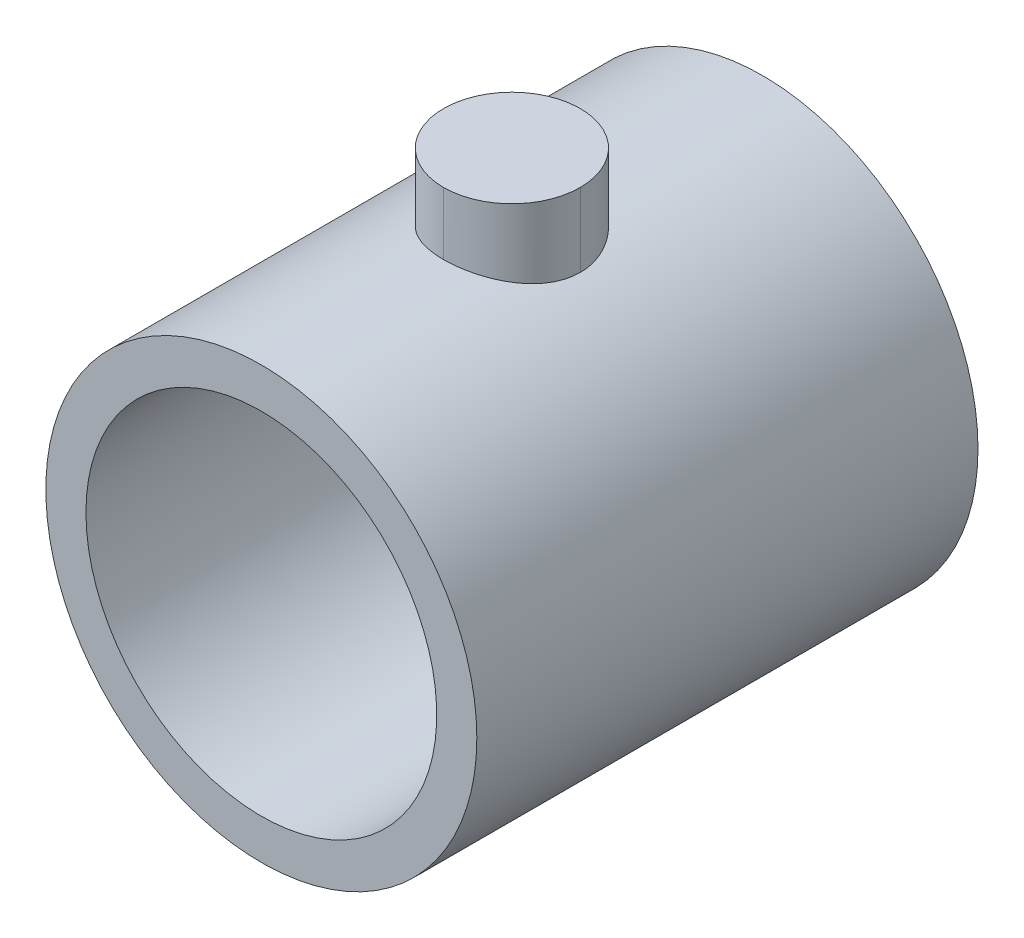
ISO-10303-21;
HEADER;
FILE_DESCRIPTION(('STEP AP214'),'2;1');
FILE_NAME('part.step','',(''),(''),'','','');
FILE_SCHEMA(('AUTOMOTIVE_DESIGN { 1 0 10303 214 1 1 1 1 }'));
ENDSEC;
DATA;
#1=APPLICATION_CONTEXT('core data for automotive mechanical design processes');
#2=APPLICATION_PROTOCOL_DEFINITION('international standard','automotive_design',2000,#1);
#3=PRODUCT_CONTEXT('',#1,'mechanical');
#4=PRODUCT('Part','Part','',(#3));
#5=PRODUCT_RELATED_PRODUCT_CATEGORY('part','',(#4));
#6=PRODUCT_DEFINITION_FORMATION('','',#4);
#7=PRODUCT_DEFINITION_CONTEXT('part definition',#1,'design');
#8=PRODUCT_DEFINITION('design','',#6,#7);
#9=PRODUCT_DEFINITION_SHAPE('','',#8);
#10=(LENGTH_UNIT() NAMED_UNIT(*) SI_UNIT(.MILLI.,.METRE.));
#11=(NAMED_UNIT(*) PLANE_ANGLE_UNIT() SI_UNIT($,.RADIAN.));
#12=(NAMED_UNIT(*) SI_UNIT($,.STERADIAN.) SOLID_ANGLE_UNIT());
#13=UNCERTAINTY_MEASURE_WITH_UNIT(LENGTH_MEASURE(1.E-05),#10,'distance_accuracy_value','');
#14=(GEOMETRIC_REPRESENTATION_CONTEXT(3) GLOBAL_UNCERTAINTY_ASSIGNED_CONTEXT((#13)) GLOBAL_UNIT_ASSIGNED_CONTEXT((#10,
#11,#12)) REPRESENTATION_CONTEXT('',''));
#15=CARTESIAN_POINT('',(0.,0.,0.));
#16=DIRECTION('',(0.,0.,1.));
#17=DIRECTION('',(1.,0.,0.));
#18=AXIS2_PLACEMENT_3D('',#15,#16,#17);
#19=CARTESIAN_POINT('',(-299.1,352.3,674.8));
#20=DIRECTION('',(0.,0.,-1.));
#21=DIRECTION('',(-1.,0.,0.));
#22=AXIS2_PLACEMENT_3D('',#19,#20,#21);
#23=CYLINDRICAL_SURFACE('',#22,21.5);
#24=CARTESIAN_POINT('',(-299.1,373.8,656.619762670699));
#25=CARTESIAN_POINT('',(-299.286849611136,373.800023702108,656.619788055512));
#26=CARTESIAN_POINT('',(-299.473689988001,373.797565078871,656.612084790181));
#27=CARTESIAN_POINT('',(-299.845948822613,373.787855810695,656.581408525158));
#28=CARTESIAN_POINT('',(-300.031367576311,373.780606192138,656.558438796016));
#29=CARTESIAN_POINT('',(-300.398992559049,373.761511751632,656.49749466458));
#30=CARTESIAN_POINT('',(-300.581205762463,373.74967867033,656.459558594359));
#31=CARTESIAN_POINT('',(-300.941619114471,373.721743452542,656.369027360901));
#32=CARTESIAN_POINT('',(-301.119819170887,373.705641218104,656.316431861316));
#33=CARTESIAN_POINT('',(-301.470892076553,373.669604599317,656.197061325536));
#34=CARTESIAN_POINT('',(-301.643767763472,373.649672298727,656.130293997506));
#35=CARTESIAN_POINT('',(-301.983230897939,373.606484179976,655.983072339063));
#36=CARTESIAN_POINT('',(-302.149815980216,373.58322712713,655.902612921812));
#37=CARTESIAN_POINT('',(-302.475598459927,373.53399349314,655.728625618388));
#38=CARTESIAN_POINT('',(-302.634795590768,373.508016813969,655.635097261111));
#39=CARTESIAN_POINT('',(-302.944900468567,373.453995485725,655.435593111171));
#40=CARTESIAN_POINT('',(-303.095805045667,373.425950055329,655.329612606545));
#41=CARTESIAN_POINT('',(-303.392490753908,373.36770077459,655.102784678811));
#42=CARTESIAN_POINT('',(-303.538009218773,373.337458437253,654.981603478992));
#43=CARTESIAN_POINT('',(-303.818448591531,373.276340252885,654.727596880684));
#44=CARTESIAN_POINT('',(-303.953365798489,373.245464189319,654.5947674497));
#45=CARTESIAN_POINT('',(-304.211726811895,373.183914593033,654.31831908519));
#46=CARTESIAN_POINT('',(-304.335169751923,373.153241075768,654.174699338365));
#47=CARTESIAN_POINT('',(-304.569782265903,373.092935246909,653.87755798348));
#48=CARTESIAN_POINT('',(-304.680951900035,373.063302930209,653.724036423975));
#49=CARTESIAN_POINT('',(-304.892980201053,373.005163121555,653.403934350579));
#50=CARTESIAN_POINT('',(-304.993497866132,372.976704536629,653.237118792763));
#51=CARTESIAN_POINT('',(-305.180030643016,372.922624937867,652.895205953089));
#52=CARTESIAN_POINT('',(-305.26605115501,372.897002868656,652.720111786273));
#53=CARTESIAN_POINT('',(-305.422939426782,372.849383537074,652.362749308705));
#54=CARTESIAN_POINT('',(-305.493804995341,372.827386798987,652.180479965015));
#55=CARTESIAN_POINT('',(-305.619706613475,372.787747211921,651.81017710179));
#56=CARTESIAN_POINT('',(-305.674749713154,372.770102424319,651.622146190926));
#57=CARTESIAN_POINT('',(-305.767088268617,372.740210811299,651.247473675112));
#58=CARTESIAN_POINT('',(-305.804873924254,372.727815731898,651.060964682541));
#59=CARTESIAN_POINT('',(-305.864736507772,372.708070383324,650.685252071749));
#60=CARTESIAN_POINT('',(-305.886819875911,372.700718045924,650.496049590773));
#61=CARTESIAN_POINT('',(-305.915081895567,372.691294262848,650.116333606294));
#62=CARTESIAN_POINT('',(-305.92126095149,372.689222682895,649.92582013625));
#63=CARTESIAN_POINT('',(-305.917652304682,372.690429659845,649.544964038913));
#64=CARTESIAN_POINT('',(-305.907864998274,372.693708083949,649.354621407497));
#65=CARTESIAN_POINT('',(-305.873154383857,372.705261433241,648.983386132854));
#66=CARTESIAN_POINT('',(-305.848869975533,372.713325372714,648.802426731596));
#67=CARTESIAN_POINT('',(-305.785925047179,372.734028063015,648.443229572215));
#68=CARTESIAN_POINT('',(-305.747259667153,372.746668360367,648.264992755404));
#69=CARTESIAN_POINT('',(-305.655904627826,372.776142547514,647.912565990144));
#70=CARTESIAN_POINT('',(-305.603219073198,372.792975209822,647.738374873443));
#71=CARTESIAN_POINT('',(-305.484230237097,372.830355350686,647.395049053186));
#72=CARTESIAN_POINT('',(-305.417921798754,372.850904235647,647.225916292301));
#73=CARTESIAN_POINT('',(-305.271146527037,372.895458586382,646.89139906547));
#74=CARTESIAN_POINT('',(-305.190487522478,372.919510042889,646.726105087879));
#75=CARTESIAN_POINT('',(-305.016251126841,372.970176647718,646.402814743336));
#76=CARTESIAN_POINT('',(-304.922669314119,372.99679267258,646.244820898983));
#77=CARTESIAN_POINT('',(-304.723239073506,373.051864497473,645.937104369589));
#78=CARTESIAN_POINT('',(-304.617390008365,373.080320393046,645.787382114831));
#79=CARTESIAN_POINT('',(-304.394099926442,373.13832549305,645.497069982092));
#80=CARTESIAN_POINT('',(-304.276658540224,373.167874732306,645.356480395398));
#81=CARTESIAN_POINT('',(-304.025083998839,373.228714037682,645.078830649772));
#82=CARTESIAN_POINT('',(-303.890424591392,373.260020432104,644.942250415067));
#83=CARTESIAN_POINT('',(-303.610069305523,373.322128313279,644.680903148553));
#84=CARTESIAN_POINT('',(-303.464376961595,373.352929957919,644.556132362065));
#85=CARTESIAN_POINT('',(-303.162757588676,373.413210525628,644.319127323276));
#86=CARTESIAN_POINT('',(-303.006825900327,373.442688836106,644.206898841926));
#87=CARTESIAN_POINT('',(-302.685835723574,373.499488975127,643.995878981829));
#88=CARTESIAN_POINT('',(-302.520780867618,373.526811651582,643.897082308561));
#89=CARTESIAN_POINT('',(-302.181084881348,373.578784966868,643.712821942092));
#90=CARTESIAN_POINT('',(-302.006372897741,373.603410316362,643.627481602057));
#91=CARTESIAN_POINT('',(-301.649960425663,373.649003761545,643.471915284115));
#92=CARTESIAN_POINT('',(-301.468262653344,373.669973261463,643.401683500499));
#93=CARTESIAN_POINT('',(-301.099132755483,373.707659414824,643.2769191724));
#94=CARTESIAN_POINT('',(-300.911700961129,373.724376313372,643.222385723096));
#95=CARTESIAN_POINT('',(-300.532509365557,373.753066466684,643.129529475876));
#96=CARTESIAN_POINT('',(-300.340749743245,373.765039917158,643.091206009149));
#97=CARTESIAN_POINT('',(-299.962076489457,373.783512798463,643.032339213343));
#98=CARTESIAN_POINT('',(-299.775272650719,373.790210654041,643.011150487655));
#99=CARTESIAN_POINT('',(-299.40044415165,373.798717882523,642.984268362587));
#100=CARTESIAN_POINT('',(-299.212419525289,373.80052739087,642.978574533889));
#101=CARTESIAN_POINT('',(-298.836586082805,373.799207500102,642.982735931094));
#102=CARTESIAN_POINT('',(-298.648777241207,373.796078760785,642.992589079777));
#103=CARTESIAN_POINT('',(-298.274758053493,373.784970992056,643.027746366384));
#104=CARTESIAN_POINT('',(-298.088547693752,373.776992004029,643.053050372472));
#105=CARTESIAN_POINT('',(-297.723903444293,373.756673495026,643.118014987086));
#106=CARTESIAN_POINT('',(-297.545393212982,373.744452662484,643.15728547842));
#107=CARTESIAN_POINT('',(-297.192344410749,373.715933934496,643.249936543445));
#108=CARTESIAN_POINT('',(-297.017807187791,373.699634677166,643.303321830744));
#109=CARTESIAN_POINT('',(-296.673954621976,373.663384257814,643.42374377334));
#110=CARTESIAN_POINT('',(-296.504637928147,373.643434050013,643.490776862129));
#111=CARTESIAN_POINT('',(-296.172176384475,373.600374643284,643.638013436823));
#112=CARTESIAN_POINT('',(-296.009033893473,373.577264252263,643.718221895083));
#113=CARTESIAN_POINT('',(-295.686053952057,373.527866421205,643.893334120884));
#114=CARTESIAN_POINT('',(-295.526395382634,373.501515018877,643.988549760478));
#115=CARTESIAN_POINT('',(-295.215567236861,373.446775128878,644.191540871442));
#116=CARTESIAN_POINT('',(-295.064400618421,373.418385939153,644.299320679448));
#117=CARTESIAN_POINT('',(-294.771505232251,373.360304522878,644.526702311104));
#118=CARTESIAN_POINT('',(-294.629776489976,373.330612292815,644.646304166638));
#119=CARTESIAN_POINT('',(-294.356584051908,373.270683495983,644.896583948005));
#120=CARTESIAN_POINT('',(-294.225120588083,373.240446916933,645.027262123996));
#121=CARTESIAN_POINT('',(-293.968075350933,373.178973222865,645.30448122238));
#122=CARTESIAN_POINT('',(-293.842955043228,373.147745853789,645.451452638939));
#123=CARTESIAN_POINT('',(-293.605554945394,373.086440370226,645.755567313567));
#124=CARTESIAN_POINT('',(-293.493270867532,373.056361874225,645.912707147414));
#125=CARTESIAN_POINT('',(-293.282194330325,372.99819161078,646.236342838258));
#126=CARTESIAN_POINT('',(-293.183413013589,372.97010149327,646.402846264183));
#127=CARTESIAN_POINT('',(-293.000235981383,372.916788781065,646.743940577196));
#128=CARTESIAN_POINT('',(-292.915834306316,372.891564999876,646.918528075526));
#129=CARTESIAN_POINT('',(-292.762233822952,372.84480846978,647.27426617975));
#130=CARTESIAN_POINT('',(-292.693000523062,372.823267371815,647.455400781107));
#131=CARTESIAN_POINT('',(-292.570128622886,372.784504727019,647.823254051486));
#132=CARTESIAN_POINT('',(-292.51648323668,372.767281301017,648.009970251497));
#133=CARTESIAN_POINT('',(-292.425338249881,372.737739203865,648.387319311367));
#134=CARTESIAN_POINT('',(-292.387809650324,372.725411726458,648.577944484521));
#135=CARTESIAN_POINT('',(-292.329152353413,372.706042893602,648.961876403566));
#136=CARTESIAN_POINT('',(-292.308012762598,372.698998027005,649.15518128117));
#137=CARTESIAN_POINT('',(-292.290187152217,372.693049448027,649.424121702964));
#138=CARTESIAN_POINT('',(-292.286454160968,372.691802269177,649.49929442607));
#139=CARTESIAN_POINT('',(-292.281480962213,372.690139901925,649.649641553976));
#140=CARTESIAN_POINT('',(-292.280237781932,372.689723721332,649.724815849473));
#141=CARTESIAN_POINT('',(-292.280237329301,372.689723811649,649.8));
#142=B_SPLINE_CURVE_WITH_KNOTS('',3,(#24,#25,#26,#27,#28,#29,#30,#31,#32,#33,#34,#35,#36,#37,
#38,#39,#40,#41,#42,#43,#44,#45,#46,#47,#48,#49,#50,#51,#52,#53,#54,#55,#56,#57,#58,#59,#60,#61,
#62,#63,#64,#65,#66,#67,#68,#69,#70,#71,#72,#73,#74,#75,#76,#77,#78,#79,#80,#81,#82,#83,#84,#85,
#86,#87,#88,#89,#90,#91,#92,#93,#94,#95,#96,#97,#98,#99,#100,#101,#102,#103,#104,#105,#106,#107,
#108,#109,#110,#111,#112,#113,#114,#115,#116,#117,#118,#119,#120,#121,#122,#123,#124,#125,#126,
#127,#128,#129,#130,#131,#132,#133,#134,#135,#136,#137,#138,#139,#140,#141),.UNSPECIFIED.,.F.,
.F.,(4,2,2,2,2,2,2,2,2,2,2,2,2,2,2,2,2,2,2,2,2,2,2,2,2,2,2,2,2,2,2,2,2,2,2,2,2,2,2,2,2,2,2,2,2,
2,2,2,2,2,2,2,2,2,2,2,2,2,4),(0.,0.560359743781014,1.12059947978438,1.67941353888878,
2.23824042055313,2.79676412738771,3.35549578982915,3.9142475983866,4.47321152690176,
5.04786350368018,5.62271521021412,6.19761028853445,6.7725025478804,7.36226211736002,
7.95180151357612,8.54142609241195,9.13078754032882,9.70216934553045,10.2733166643894,
10.8444494602515,11.4155680794587,11.9632037918613,12.5110247441492,13.0586854875736,
13.6065539283805,14.1624030042838,14.718442741849,15.2745113770874,15.8305977395095,
16.4129354865586,16.9950874596482,17.5775061985007,18.1596946910844,18.7469435168708,
19.3339662780239,19.9209551975628,20.5079198960321,21.0715850282617,21.6352345428268,
22.1988087549951,22.7623781585073,23.3113041065293,23.8604135993869,24.4093797801366,
24.9585536175636,25.5211813010285,26.0840037586825,26.6468277342929,27.2096644246007,
27.7955546516793,28.38124859628,28.9674229804796,29.5533538324634,30.137938171304,
30.7222676391732,31.3055412714969,31.8884268797905,32.1142179830095,32.3397393359071),.UNSPECIFIED.);
#143=CARTESIAN_POINT('',(-299.1,373.8,656.619762670699));
#144=VERTEX_POINT('',#143);
#145=CARTESIAN_POINT('',(-292.280237329301,372.689723811649,649.8));
#146=VERTEX_POINT('',#145);
#147=EDGE_CURVE('E63',#144,#146,#142,.T.);
#148=ORIENTED_EDGE('',*,*,#147,.T.);
#149=CARTESIAN_POINT('',(-292.280237329301,372.689723811649,649.8));
#150=CARTESIAN_POINT('',(-292.280211416672,372.689695078506,649.986616922159));
#151=CARTESIAN_POINT('',(-292.287896057839,372.692284862618,650.173223202868));
#152=CARTESIAN_POINT('',(-292.318494089589,372.702491409205,650.544999835778));
#153=CARTESIAN_POINT('',(-292.341403711886,372.710106927773,650.730170531825));
#154=CARTESIAN_POINT('',(-292.40217394527,372.730126887538,651.097238139797));
#155=CARTESIAN_POINT('',(-292.439992326143,372.74251779986,651.279142794413));
#156=CARTESIAN_POINT('',(-292.530230044217,372.771697136978,651.638934270502));
#157=CARTESIAN_POINT('',(-292.582649834885,372.788485698347,651.816820967005));
#158=CARTESIAN_POINT('',(-292.701600904426,372.825943726534,652.167249354588));
#159=CARTESIAN_POINT('',(-292.76812258176,372.84661055167,652.339794591356));
#160=CARTESIAN_POINT('',(-292.914792703252,372.891238082411,652.678622316006));
#161=CARTESIAN_POINT('',(-292.994946207961,372.915200010625,652.844902449985));
#162=CARTESIAN_POINT('',(-293.168283302984,372.965741792978,653.170142969482));
#163=CARTESIAN_POINT('',(-293.261469136048,372.992322097483,653.329102088846));
#164=CARTESIAN_POINT('',(-293.460254073926,373.047383040616,653.638788618533));
#165=CARTESIAN_POINT('',(-293.565857630119,373.075864359108,653.789513048438));
#166=CARTESIAN_POINT('',(-293.792313203692,373.13488849885,654.086441626871));
#167=CARTESIAN_POINT('',(-293.913542636814,373.165468053905,654.232350758434));
#168=CARTESIAN_POINT('',(-294.167685157746,373.227000753971,654.513528127333));
#169=CARTESIAN_POINT('',(-294.300598450566,373.257953905529,654.648796177875));
#170=CARTESIAN_POINT('',(-294.577334346785,373.319409792881,654.90789577337));
#171=CARTESIAN_POINT('',(-294.721160984351,373.349912357086,655.031723051309));
#172=CARTESIAN_POINT('',(-295.018746102899,373.409627819645,655.267037598887));
#173=CARTESIAN_POINT('',(-295.172501110711,373.438841163041,655.378529147206));
#174=CARTESIAN_POINT('',(-295.492867030859,373.495888520731,655.590991295739));
#175=CARTESIAN_POINT('',(-295.659698661141,373.523672226806,655.691643021314));
#176=CARTESIAN_POINT('',(-296.001658816913,373.576282525811,655.878436573725));
#177=CARTESIAN_POINT('',(-296.176784157176,373.601110241332,655.964583914041));
#178=CARTESIAN_POINT('',(-296.534097827152,373.647097029849,656.121657913554));
#179=CARTESIAN_POINT('',(-296.716282242434,373.66825810145,656.192592869722));
#180=CARTESIAN_POINT('',(-297.086390454882,373.706308086532,656.318648903094));
#181=CARTESIAN_POINT('',(-297.274312806759,373.72319806604,656.373773926778));
#182=CARTESIAN_POINT('',(-297.73125543129,373.758049206617,656.486633295462));
#183=CARTESIAN_POINT('',(-298.002472428456,373.773705130173,656.536486940962));
#184=CARTESIAN_POINT('',(-298.412377784981,373.789438716033,656.586408969009));
#185=CARTESIAN_POINT('',(-298.549538397207,373.793391534777,656.59890657728));
#186=CARTESIAN_POINT('',(-298.824450740147,373.798674082737,656.615584143486));
#187=CARTESIAN_POINT('',(-298.962202616612,373.800003122943,656.619761916611));
#188=CARTESIAN_POINT('',(-299.1,373.8,656.619762670699));
#189=B_SPLINE_CURVE_WITH_KNOTS('',3,(#149,#150,#151,#152,#153,#154,#155,#156,#157,#158,#159,
#160,#161,#162,#163,#164,#165,#166,#167,#168,#169,#170,#171,#172,#173,#174,#175,#176,#177,#178,
#179,#180,#181,#182,#183,#184,#185,#186,#187,#188),.UNSPECIFIED.,.F.,.F.,(4,2,2,2,2,2,2,2,2,2,2,
2,2,2,2,2,2,2,2,4),(0.,0.559658204271593,1.11917794091953,1.6771240528343,2.23508749444292,
2.79267224919575,3.35046445009721,3.90835276056506,4.46644167033533,5.04223240683662,
5.61803324847288,6.19404798426466,6.76986229732098,7.35957417590168,7.94906138170205,
8.53822625357595,9.12724392960374,9.9533461978748,10.3664699144853,10.7797021040584),.UNSPECIFIED.);
#190=EDGE_CURVE('E50',#146,#144,#189,.T.);
#191=ORIENTED_EDGE('',*,*,#190,.T.);
#192=EDGE_LOOP('',(#148,#191));
#193=FACE_BOUND('',#192,.T.);
#194=CARTESIAN_POINT('',(-299.1,352.3,674.8));
#195=DIRECTION('',(0.,0.,-1.));
#196=DIRECTION('',(1.,0.,0.));
#197=AXIS2_PLACEMENT_3D('',#194,#195,#196);
#198=CIRCLE('',#197,21.5);
#199=CARTESIAN_POINT('',(-277.6,352.3,674.8));
#200=VERTEX_POINT('',#199);
#201=EDGE_CURVE('E11',#200,#200,#198,.T.);
#202=ORIENTED_EDGE('',*,*,#201,.T.);
#203=EDGE_LOOP('',(#202));
#204=FACE_BOUND('',#203,.T.);
#205=CARTESIAN_POINT('',(-299.1,352.3,624.8));
#206=DIRECTION('',(0.,0.,-1.));
#207=DIRECTION('',(1.,0.,0.));
#208=AXIS2_PLACEMENT_3D('',#205,#206,#207);
#209=CIRCLE('',#208,21.5);
#210=CARTESIAN_POINT('',(-277.6,352.3,624.8));
#211=VERTEX_POINT('',#210);
#212=EDGE_CURVE('E40',#211,#211,#209,.T.);
#213=ORIENTED_EDGE('',*,*,#212,.F.);
#214=EDGE_LOOP('',(#213));
#215=FACE_BOUND('',#214,.T.);
#216=ADVANCED_FACE('F37',(#193,#204,#215),#23,.T.);
#217=CARTESIAN_POINT('',(-299.1,352.3,674.8));
#218=DIRECTION('',(0.,0.,1.));
#219=DIRECTION('',(1.,0.,0.));
#220=AXIS2_PLACEMENT_3D('',#217,#218,#219);
#221=PLANE('',#220);
#222=CARTESIAN_POINT('',(-299.1,352.3,674.8));
#223=DIRECTION('',(0.,0.,1.));
#224=DIRECTION('',(-1.,0.,0.));
#225=AXIS2_PLACEMENT_3D('',#222,#223,#224);
#226=CIRCLE('',#225,17.5);
#227=CARTESIAN_POINT('',(-316.6,352.3,674.8));
#228=VERTEX_POINT('',#227);
#229=EDGE_CURVE('E122',#228,#228,#226,.T.);
#230=ORIENTED_EDGE('',*,*,#229,.F.);
#231=EDGE_LOOP('',(#230));
#232=FACE_BOUND('',#231,.T.);
#233=ORIENTED_EDGE('',*,*,#201,.F.);
#234=EDGE_LOOP('',(#233));
#235=FACE_BOUND('',#234,.T.);
#236=ADVANCED_FACE('F108',(#232,#235),#221,.T.);
#237=CARTESIAN_POINT('',(-299.1,352.3,624.8));
#238=DIRECTION('',(0.,0.,1.));
#239=DIRECTION('',(1.,0.,0.));
#240=AXIS2_PLACEMENT_3D('',#237,#238,#239);
#241=PLANE('',#240);
#242=CARTESIAN_POINT('',(-299.1,352.3,624.8));
#243=DIRECTION('',(0.,0.,1.));
#244=DIRECTION('',(-1.,0.,0.));
#245=AXIS2_PLACEMENT_3D('',#242,#243,#244);
#246=CIRCLE('',#245,17.5);
#247=CARTESIAN_POINT('',(-316.6,352.3,624.8));
#248=VERTEX_POINT('',#247);
#249=EDGE_CURVE('E128',#248,#248,#246,.T.);
#250=ORIENTED_EDGE('',*,*,#249,.T.);
#251=EDGE_LOOP('',(#250));
#252=FACE_BOUND('',#251,.T.);
#253=ORIENTED_EDGE('',*,*,#212,.T.);
#254=EDGE_LOOP('',(#253));
#255=FACE_BOUND('',#254,.T.);
#256=ADVANCED_FACE('F104',(#252,#255),#241,.F.);
#257=CARTESIAN_POINT('',(-299.1,352.3,624.8));
#258=DIRECTION('',(0.,0.,1.));
#259=DIRECTION('',(1.,0.,0.));
#260=AXIS2_PLACEMENT_3D('',#257,#258,#259);
#261=CYLINDRICAL_SURFACE('',#260,17.5);
#262=ORIENTED_EDGE('',*,*,#249,.F.);
#263=EDGE_LOOP('',(#262));
#264=FACE_BOUND('',#263,.T.);
#265=ORIENTED_EDGE('',*,*,#229,.T.);
#266=EDGE_LOOP('',(#265));
#267=FACE_BOUND('',#266,.T.);
#268=ADVANCED_FACE('F99',(#264,#267),#261,.F.);
#269=CARTESIAN_POINT('',(-299.1,330.798,649.8));
#270=DIRECTION('',(0.,1.,0.));
#271=DIRECTION('',(0.,0.,1.));
#272=AXIS2_PLACEMENT_3D('',#269,#270,#271);
#273=CYLINDRICAL_SURFACE('',#272,6.81976267069909);
#274=ORIENTED_EDGE('',*,*,#147,.F.);
#275=DIRECTION('',(0.,1.,0.));
#276=VECTOR('',#275,1.);
#277=CARTESIAN_POINT('',(-299.1,330.798,656.619762670699));
#278=LINE('',#277,#276);
#279=CARTESIAN_POINT('',(-299.1,380.036620922553,656.619762670699));
#280=VERTEX_POINT('',#279);
#281=EDGE_CURVE('E67',#144,#280,#278,.T.);
#282=ORIENTED_EDGE('',*,*,#281,.T.);
#283=CARTESIAN_POINT('',(-299.1,380.036620922553,649.8));
#284=DIRECTION('',(0.,1.,0.));
#285=DIRECTION('',(0.,0.,-1.));
#286=AXIS2_PLACEMENT_3D('',#283,#284,#285);
#287=CIRCLE('',#286,6.81976267069909);
#288=CARTESIAN_POINT('',(-292.280237329301,380.036620922553,649.8));
#289=VERTEX_POINT('',#288);
#290=EDGE_CURVE('E74',#289,#280,#287,.T.);
#291=ORIENTED_EDGE('',*,*,#290,.F.);
#292=DIRECTION('',(0.,1.,0.));
#293=VECTOR('',#292,1.);
#294=CARTESIAN_POINT('',(-292.280237329301,330.798,649.8));
#295=LINE('',#294,#293);
#296=EDGE_CURVE('E57',#146,#289,#295,.T.);
#297=ORIENTED_EDGE('',*,*,#296,.F.);
#298=EDGE_LOOP('',(#274,#282,#291,#297));
#299=FACE_BOUND('',#298,.T.);
#300=ADVANCED_FACE('F72',(#299),#273,.T.);
#301=CARTESIAN_POINT('',(-299.1,330.798,649.8));
#302=DIRECTION('',(0.,1.,0.));
#303=DIRECTION('',(0.,0.,1.));
#304=AXIS2_PLACEMENT_3D('',#301,#302,#303);
#305=CYLINDRICAL_SURFACE('',#304,6.81976267069909);
#306=ORIENTED_EDGE('',*,*,#190,.F.);
#307=ORIENTED_EDGE('',*,*,#296,.T.);
#308=CARTESIAN_POINT('',(-299.1,380.036620922553,649.8));
#309=DIRECTION('',(0.,1.,0.));
#310=DIRECTION('',(0.,0.,-1.));
#311=AXIS2_PLACEMENT_3D('',#308,#309,#310);
#312=CIRCLE('',#311,6.81976267069909);
#313=EDGE_CURVE('E75',#280,#289,#312,.T.);
#314=ORIENTED_EDGE('',*,*,#313,.F.);
#315=ORIENTED_EDGE('',*,*,#281,.F.);
#316=EDGE_LOOP('',(#306,#307,#314,#315));
#317=FACE_BOUND('',#316,.T.);
#318=ADVANCED_FACE('F69',(#317),#305,.T.);
#319=CARTESIAN_POINT('',(-299.1,380.036620922553,649.8));
#320=DIRECTION('',(0.,-1.,0.));
#321=DIRECTION('',(0.,0.,-1.));
#322=AXIS2_PLACEMENT_3D('',#319,#320,#321);
#323=PLANE('',#322);
#324=ORIENTED_EDGE('',*,*,#290,.T.);
#325=ORIENTED_EDGE('',*,*,#313,.T.);
#326=EDGE_LOOP('',(#324,#325));
#327=FACE_BOUND('',#326,.T.);
#328=ADVANCED_FACE('F95',(#327),#323,.F.);
#329=CLOSED_SHELL('',(#216,#236,#256,#268,#300,#318,#328));
#330=MANIFOLD_SOLID_BREP('B2',#329);
#331=ADVANCED_BREP_SHAPE_REPRESENTATION('',(#18,#330),#14);
#332=SHAPE_DEFINITION_REPRESENTATION(#9,#331);
ENDSEC;
END-ISO-10303-21;
